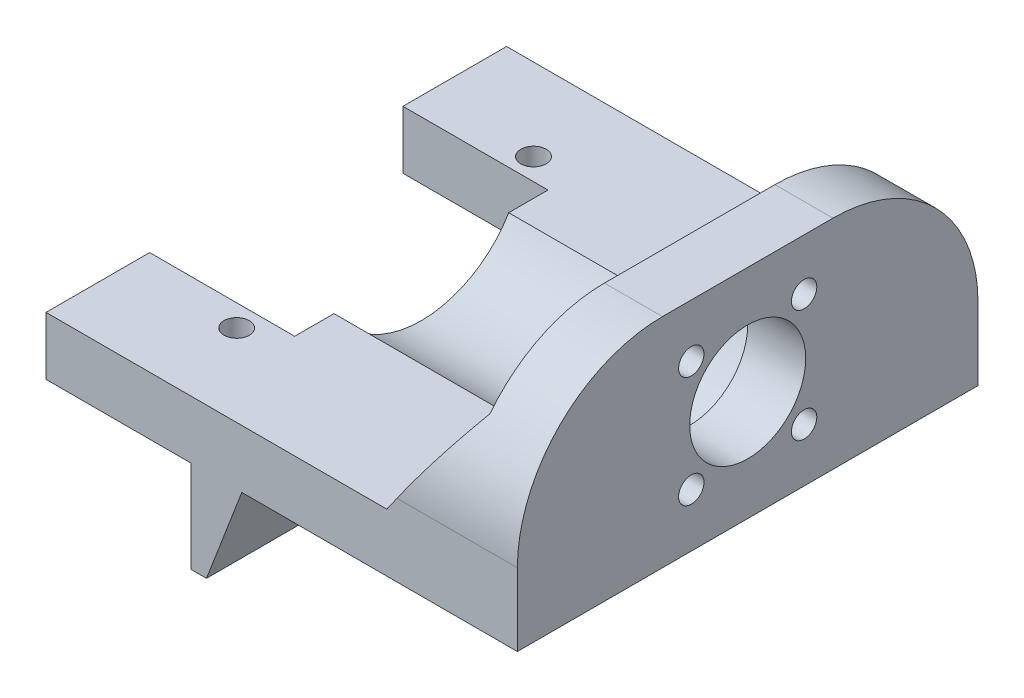
ISO-10303-21;
HEADER;
FILE_DESCRIPTION(('STEP AP214'),'2;1');
FILE_NAME('part.step','',(''),(''),'','','');
FILE_SCHEMA(('AUTOMOTIVE_DESIGN { 1 0 10303 214 1 1 1 1 }'));
ENDSEC;
DATA;
#1=APPLICATION_CONTEXT('core data for automotive mechanical design processes');
#2=APPLICATION_PROTOCOL_DEFINITION('international standard','automotive_design',2000,#1);
#3=PRODUCT_CONTEXT('',#1,'mechanical');
#4=PRODUCT('Part','Part','',(#3));
#5=PRODUCT_RELATED_PRODUCT_CATEGORY('part','',(#4));
#6=PRODUCT_DEFINITION_FORMATION('','',#4);
#7=PRODUCT_DEFINITION_CONTEXT('part definition',#1,'design');
#8=PRODUCT_DEFINITION('design','',#6,#7);
#9=PRODUCT_DEFINITION_SHAPE('','',#8);
#10=(LENGTH_UNIT() NAMED_UNIT(*) SI_UNIT(.MILLI.,.METRE.));
#11=(NAMED_UNIT(*) PLANE_ANGLE_UNIT() SI_UNIT($,.RADIAN.));
#12=(NAMED_UNIT(*) SI_UNIT($,.STERADIAN.) SOLID_ANGLE_UNIT());
#13=UNCERTAINTY_MEASURE_WITH_UNIT(LENGTH_MEASURE(1.E-05),#10,'distance_accuracy_value','');
#14=(GEOMETRIC_REPRESENTATION_CONTEXT(3) GLOBAL_UNCERTAINTY_ASSIGNED_CONTEXT((#13)) GLOBAL_UNIT_ASSIGNED_CONTEXT((#10,
#11,#12)) REPRESENTATION_CONTEXT('',''));
#15=CARTESIAN_POINT('',(0.,0.,0.));
#16=DIRECTION('',(0.,0.,1.));
#17=DIRECTION('',(1.,0.,0.));
#18=AXIS2_PLACEMENT_3D('',#15,#16,#17);
#19=CARTESIAN_POINT('',(0.,0.,0.));
#20=DIRECTION('',(0.,1.,0.));
#21=DIRECTION('',(0.,0.,1.));
#22=AXIS2_PLACEMENT_3D('',#19,#20,#21);
#23=PLANE('',#22);
#24=DIRECTION('',(1.,0.,0.));
#25=VECTOR('',#24,1.);
#26=CARTESIAN_POINT('',(0.,0.,31.755));
#27=LINE('',#26,#25);
#28=CARTESIAN_POINT('',(7.00000000000009,0.,31.755));
#29=VERTEX_POINT('',#28);
#30=CARTESIAN_POINT('',(45.,0.,31.755));
#31=VERTEX_POINT('',#30);
#32=EDGE_CURVE('E349',#29,#31,#27,.T.);
#33=ORIENTED_EDGE('',*,*,#32,.F.);
#34=DIRECTION('',(0.,0.,-1.));
#35=VECTOR('',#34,1.);
#36=CARTESIAN_POINT('',(7.00000000000009,0.,17.465));
#37=LINE('',#36,#35);
#38=CARTESIAN_POINT('',(7.00000000000009,0.,17.465));
#39=VERTEX_POINT('',#38);
#40=EDGE_CURVE('E404',#29,#39,#37,.T.);
#41=ORIENTED_EDGE('',*,*,#40,.T.);
#42=DIRECTION('',(1.,0.,0.));
#43=VECTOR('',#42,1.);
#44=CARTESIAN_POINT('',(0.,0.,17.465));
#45=LINE('',#44,#43);
#46=CARTESIAN_POINT('',(0.,0.,17.465));
#47=VERTEX_POINT('',#46);
#48=EDGE_CURVE('E270',#47,#39,#45,.T.);
#49=ORIENTED_EDGE('',*,*,#48,.F.);
#50=DIRECTION('',(0.,0.,-1.));
#51=VECTOR('',#50,1.);
#52=CARTESIAN_POINT('',(0.,0.,0.));
#53=LINE('',#52,#51);
#54=CARTESIAN_POINT('',(0.,0.,7.145));
#55=VERTEX_POINT('',#54);
#56=EDGE_CURVE('E341',#47,#55,#53,.T.);
#57=ORIENTED_EDGE('',*,*,#56,.T.);
#58=DIRECTION('',(-1.,0.,0.));
#59=VECTOR('',#58,1.);
#60=CARTESIAN_POINT('',(0.,0.,7.145));
#61=LINE('',#60,#59);
#62=CARTESIAN_POINT('',(7.00000000000009,0.,7.14500000000001));
#63=VERTEX_POINT('',#62);
#64=EDGE_CURVE('E239',#63,#55,#61,.T.);
#65=ORIENTED_EDGE('',*,*,#64,.F.);
#66=DIRECTION('',(0.,0.,-1.));
#67=VECTOR('',#66,1.);
#68=CARTESIAN_POINT('',(7.00000000000009,0.,-7.145));
#69=LINE('',#68,#67);
#70=CARTESIAN_POINT('',(7.00000000000009,0.,-7.14500000000001));
#71=VERTEX_POINT('',#70);
#72=EDGE_CURVE('E429',#63,#71,#69,.T.);
#73=ORIENTED_EDGE('',*,*,#72,.T.);
#74=DIRECTION('',(1.,0.,0.));
#75=VECTOR('',#74,1.);
#76=CARTESIAN_POINT('',(0.,0.,-7.145));
#77=LINE('',#76,#75);
#78=CARTESIAN_POINT('',(0.,0.,-7.145));
#79=VERTEX_POINT('',#78);
#80=EDGE_CURVE('E639',#79,#71,#77,.T.);
#81=ORIENTED_EDGE('',*,*,#80,.F.);
#82=CARTESIAN_POINT('',(0.,0.,-17.465));
#83=VERTEX_POINT('',#82);
#84=EDGE_CURVE('E244',#79,#83,#53,.T.);
#85=ORIENTED_EDGE('',*,*,#84,.T.);
#86=DIRECTION('',(-1.,0.,0.));
#87=VECTOR('',#86,1.);
#88=CARTESIAN_POINT('',(0.,0.,-17.465));
#89=LINE('',#88,#87);
#90=CARTESIAN_POINT('',(7.00000000000009,0.,-17.465));
#91=VERTEX_POINT('',#90);
#92=EDGE_CURVE('E250',#91,#83,#89,.T.);
#93=ORIENTED_EDGE('',*,*,#92,.F.);
#94=DIRECTION('',(0.,0.,-1.));
#95=VECTOR('',#94,1.);
#96=CARTESIAN_POINT('',(7.00000000000009,0.,-31.755));
#97=LINE('',#96,#95);
#98=CARTESIAN_POINT('',(7.00000000000009,0.,-31.755));
#99=VERTEX_POINT('',#98);
#100=EDGE_CURVE('E427',#91,#99,#97,.T.);
#101=ORIENTED_EDGE('',*,*,#100,.T.);
#102=DIRECTION('',(1.,0.,0.));
#103=VECTOR('',#102,1.);
#104=CARTESIAN_POINT('',(0.,0.,-31.755));
#105=LINE('',#104,#103);
#106=CARTESIAN_POINT('',(45.,0.,-31.755));
#107=VERTEX_POINT('',#106);
#108=EDGE_CURVE('E565',#99,#107,#105,.T.);
#109=ORIENTED_EDGE('',*,*,#108,.T.);
#110=DIRECTION('',(0.,0.,1.));
#111=VECTOR('',#110,1.);
#112=CARTESIAN_POINT('',(45.,0.,0.));
#113=LINE('',#112,#111);
#114=EDGE_CURVE('E352',#107,#31,#113,.T.);
#115=ORIENTED_EDGE('',*,*,#114,.T.);
#116=EDGE_LOOP('',(#33,#41,#49,#57,#65,#73,#81,#85,#93,#101,#109,#115));
#117=FACE_BOUND('',#116,.T.);
#118=ADVANCED_FACE('F34',(#117),#23,.F.);
#119=CARTESIAN_POINT('',(-5.,0.,-20.465));
#120=DIRECTION('',(0.,-1.,0.));
#121=DIRECTION('',(0.,0.,-1.));
#122=AXIS2_PLACEMENT_3D('',#119,#120,#121);
#123=CIRCLE('',#122,1.75);
#124=CARTESIAN_POINT('',(-5.,0.,-22.215));
#125=VERTEX_POINT('',#124);
#126=EDGE_CURVE('E279',#125,#125,#123,.T.);
#127=ORIENTED_EDGE('',*,*,#126,.F.);
#128=EDGE_LOOP('',(#127));
#129=FACE_BOUND('',#128,.T.);
#130=DIRECTION('',(0.,0.,-1.));
#131=VECTOR('',#130,1.);
#132=CARTESIAN_POINT('',(0.,0.,-17.465));
#133=LINE('',#132,#131);
#134=CARTESIAN_POINT('',(0.,0.,-31.755));
#135=VERTEX_POINT('',#134);
#136=EDGE_CURVE('E246',#83,#135,#133,.T.);
#137=ORIENTED_EDGE('',*,*,#136,.F.);
#138=DIRECTION('',(-1.,0.,0.));
#139=VECTOR('',#138,1.);
#140=CARTESIAN_POINT('',(0.,0.,-17.465));
#141=LINE('',#140,#139);
#142=CARTESIAN_POINT('',(-20.,0.,-17.465));
#143=VERTEX_POINT('',#142);
#144=EDGE_CURVE('E340',#83,#143,#141,.T.);
#145=ORIENTED_EDGE('',*,*,#144,.T.);
#146=DIRECTION('',(0.,0.,-1.));
#147=VECTOR('',#146,1.);
#148=CARTESIAN_POINT('',(-20.,0.,0.));
#149=LINE('',#148,#147);
#150=CARTESIAN_POINT('',(-20.,0.,-31.755));
#151=VERTEX_POINT('',#150);
#152=EDGE_CURVE('E558',#143,#151,#149,.T.);
#153=ORIENTED_EDGE('',*,*,#152,.T.);
#154=EDGE_CURVE('E560',#151,#135,#105,.T.);
#155=ORIENTED_EDGE('',*,*,#154,.T.);
#156=EDGE_LOOP('',(#137,#145,#153,#155));
#157=FACE_BOUND('',#156,.T.);
#158=ADVANCED_FACE('F566',(#129,#157),#23,.F.);
#159=CARTESIAN_POINT('',(-5.,0.,20.465));
#160=DIRECTION('',(0.,1.,0.));
#161=DIRECTION('',(0.,0.,1.));
#162=AXIS2_PLACEMENT_3D('',#159,#160,#161);
#163=CIRCLE('',#162,1.75);
#164=CARTESIAN_POINT('',(-5.,0.,22.215));
#165=VERTEX_POINT('',#164);
#166=EDGE_CURVE('E285',#165,#165,#163,.T.);
#167=ORIENTED_EDGE('',*,*,#166,.T.);
#168=EDGE_LOOP('',(#167));
#169=FACE_BOUND('',#168,.T.);
#170=DIRECTION('',(0.,0.,-1.));
#171=VECTOR('',#170,1.);
#172=CARTESIAN_POINT('',(0.,0.,17.465));
#173=LINE('',#172,#171);
#174=CARTESIAN_POINT('',(0.,0.,31.755));
#175=VERTEX_POINT('',#174);
#176=EDGE_CURVE('E267',#175,#47,#173,.T.);
#177=ORIENTED_EDGE('',*,*,#176,.F.);
#178=CARTESIAN_POINT('',(-20.,0.,31.755));
#179=VERTEX_POINT('',#178);
#180=EDGE_CURVE('E359',#179,#175,#27,.T.);
#181=ORIENTED_EDGE('',*,*,#180,.F.);
#182=DIRECTION('',(0.,0.,1.));
#183=VECTOR('',#182,1.);
#184=CARTESIAN_POINT('',(-20.,0.,0.));
#185=LINE('',#184,#183);
#186=CARTESIAN_POINT('',(-20.,0.,17.465));
#187=VERTEX_POINT('',#186);
#188=EDGE_CURVE('E346',#187,#179,#185,.T.);
#189=ORIENTED_EDGE('',*,*,#188,.F.);
#190=DIRECTION('',(-1.,0.,0.));
#191=VECTOR('',#190,1.);
#192=CARTESIAN_POINT('',(0.,0.,17.465));
#193=LINE('',#192,#191);
#194=EDGE_CURVE('E343',#47,#187,#193,.T.);
#195=ORIENTED_EDGE('',*,*,#194,.F.);
#196=EDGE_LOOP('',(#177,#181,#189,#195));
#197=FACE_BOUND('',#196,.T.);
#198=ADVANCED_FACE('F383',(#169,#197),#23,.F.);
#199=CARTESIAN_POINT('',(-20.,8.,-31.755));
#200=DIRECTION('',(0.,-1.,0.));
#201=DIRECTION('',(0.,0.,-1.));
#202=AXIS2_PLACEMENT_3D('',#199,#200,#201);
#203=PLANE('',#202);
#204=CARTESIAN_POINT('',(-5.,8.,-20.465));
#205=DIRECTION('',(0.,-1.,0.));
#206=DIRECTION('',(0.,0.,-1.));
#207=AXIS2_PLACEMENT_3D('',#204,#205,#206);
#208=CIRCLE('',#207,1.75);
#209=CARTESIAN_POINT('',(-5.,8.,-22.215));
#210=VERTEX_POINT('',#209);
#211=EDGE_CURVE('E278',#210,#210,#208,.T.);
#212=ORIENTED_EDGE('',*,*,#211,.T.);
#213=EDGE_LOOP('',(#212));
#214=FACE_BOUND('',#213,.T.);
#215=DIRECTION('',(-1.,0.,0.));
#216=VECTOR('',#215,1.);
#217=CARTESIAN_POINT('',(76.5979797464467,8.,-12.0454047254544));
#218=LINE('',#217,#216);
#219=CARTESIAN_POINT('',(0.,8.,-12.0454047254544));
#220=VERTEX_POINT('',#219);
#221=CARTESIAN_POINT('',(27.,8.,-12.0454047254544));
#222=VERTEX_POINT('',#221);
#223=EDGE_CURVE('E297',#220,#222,#218,.F.);
#224=ORIENTED_EDGE('',*,*,#223,.T.);
#225=DIRECTION('',(0.,0.,-1.));
#226=VECTOR('',#225,1.);
#227=CARTESIAN_POINT('',(27.,8.,-31.755));
#228=LINE('',#227,#226);
#229=CARTESIAN_POINT('',(27.,8.,-31.755));
#230=VERTEX_POINT('',#229);
#231=EDGE_CURVE('E473',#222,#230,#228,.T.);
#232=ORIENTED_EDGE('',*,*,#231,.T.);
#233=DIRECTION('',(1.,0.,0.));
#234=VECTOR('',#233,1.);
#235=CARTESIAN_POINT('',(-20.,8.,-31.755));
#236=LINE('',#235,#234);
#237=CARTESIAN_POINT('',(-20.,8.,-31.755));
#238=VERTEX_POINT('',#237);
#239=EDGE_CURVE('E318',#238,#230,#236,.T.);
#240=ORIENTED_EDGE('',*,*,#239,.F.);
#241=DIRECTION('',(0.,0.,1.));
#242=VECTOR('',#241,1.);
#243=CARTESIAN_POINT('',(-20.,8.,-31.755));
#244=LINE('',#243,#242);
#245=CARTESIAN_POINT('',(-20.,8.,-17.465));
#246=VERTEX_POINT('',#245);
#247=EDGE_CURVE('E328',#238,#246,#244,.T.);
#248=ORIENTED_EDGE('',*,*,#247,.T.);
#249=DIRECTION('',(1.,0.,0.));
#250=VECTOR('',#249,1.);
#251=CARTESIAN_POINT('',(0.,8.,-17.465));
#252=LINE('',#251,#250);
#253=CARTESIAN_POINT('',(0.,8.,-17.465));
#254=VERTEX_POINT('',#253);
#255=EDGE_CURVE('E453',#246,#254,#252,.T.);
#256=ORIENTED_EDGE('',*,*,#255,.T.);
#257=DIRECTION('',(0.,0.,1.));
#258=VECTOR('',#257,1.);
#259=CARTESIAN_POINT('',(0.,8.,0.));
#260=LINE('',#259,#258);
#261=EDGE_CURVE('E330',#254,#220,#260,.T.);
#262=ORIENTED_EDGE('',*,*,#261,.T.);
#263=EDGE_LOOP('',(#224,#232,#240,#248,#256,#262));
#264=FACE_BOUND('',#263,.T.);
#265=ADVANCED_FACE('F537',(#214,#264),#203,.F.);
#266=CARTESIAN_POINT('',(0.,30.,0.));
#267=DIRECTION('',(-1.,0.,0.));
#268=DIRECTION('',(0.,0.,1.));
#269=AXIS2_PLACEMENT_3D('',#266,#267,#268);
#270=PLANE('',#269);
#271=CARTESIAN_POINT('',(0.,15.135,0.));
#272=DIRECTION('',(-1.,0.,0.));
#273=DIRECTION('',(0.,0.,1.));
#274=AXIS2_PLACEMENT_3D('',#271,#272,#273);
#275=CIRCLE('',#274,14.);
#276=CARTESIAN_POINT('',(0.,8.,12.0454047254544));
#277=VERTEX_POINT('',#276);
#278=EDGE_CURVE('E288',#220,#277,#275,.T.);
#279=ORIENTED_EDGE('',*,*,#278,.F.);
#280=ORIENTED_EDGE('',*,*,#261,.F.);
#281=DIRECTION('',(0.,-1.,0.));
#282=VECTOR('',#281,1.);
#283=CARTESIAN_POINT('',(0.,30.,-17.465));
#284=LINE('',#283,#282);
#285=EDGE_CURVE('E339',#254,#83,#284,.T.);
#286=ORIENTED_EDGE('',*,*,#285,.T.);
#287=ORIENTED_EDGE('',*,*,#84,.F.);
#288=DIRECTION('',(0.,1.,0.));
#289=VECTOR('',#288,1.);
#290=CARTESIAN_POINT('',(0.,-12.7,-7.145));
#291=LINE('',#290,#289);
#292=CARTESIAN_POINT('',(0.,-12.7,-7.145));
#293=VERTEX_POINT('',#292);
#294=EDGE_CURVE('E225',#293,#79,#291,.T.);
#295=ORIENTED_EDGE('',*,*,#294,.F.);
#296=DIRECTION('',(0.,0.,-1.));
#297=VECTOR('',#296,1.);
#298=CARTESIAN_POINT('',(0.,-12.7,7.145));
#299=LINE('',#298,#297);
#300=CARTESIAN_POINT('',(0.,-12.7,7.145));
#301=VERTEX_POINT('',#300);
#302=EDGE_CURVE('E232',#301,#293,#299,.T.);
#303=ORIENTED_EDGE('',*,*,#302,.F.);
#304=DIRECTION('',(0.,1.,0.));
#305=VECTOR('',#304,1.);
#306=CARTESIAN_POINT('',(0.,-12.7,7.145));
#307=LINE('',#306,#305);
#308=EDGE_CURVE('E247',#301,#55,#307,.T.);
#309=ORIENTED_EDGE('',*,*,#308,.T.);
#310=ORIENTED_EDGE('',*,*,#56,.F.);
#311=DIRECTION('',(0.,-1.,0.));
#312=VECTOR('',#311,1.);
#313=CARTESIAN_POINT('',(0.,30.,17.465));
#314=LINE('',#313,#312);
#315=CARTESIAN_POINT('',(0.,8.,17.465));
#316=VERTEX_POINT('',#315);
#317=EDGE_CURVE('E391',#316,#47,#314,.T.);
#318=ORIENTED_EDGE('',*,*,#317,.F.);
#319=EDGE_CURVE('E327',#277,#316,#260,.T.);
#320=ORIENTED_EDGE('',*,*,#319,.F.);
#321=EDGE_LOOP('',(#279,#280,#286,#287,#295,#303,#309,#310,#318,#320));
#322=FACE_BOUND('',#321,.T.);
#323=ADVANCED_FACE('F242',(#322),#270,.T.);
#324=CARTESIAN_POINT('',(0.,30.,17.465));
#325=DIRECTION('',(0.,0.,1.));
#326=DIRECTION('',(1.,0.,0.));
#327=AXIS2_PLACEMENT_3D('',#324,#325,#326);
#328=PLANE('',#327);
#329=DIRECTION('',(0.,-1.,0.));
#330=VECTOR('',#329,1.);
#331=CARTESIAN_POINT('',(-20.,30.,17.465));
#332=LINE('',#331,#330);
#333=CARTESIAN_POINT('',(-20.,8.,17.465));
#334=VERTEX_POINT('',#333);
#335=EDGE_CURVE('E444',#334,#187,#332,.T.);
#336=ORIENTED_EDGE('',*,*,#335,.F.);
#337=DIRECTION('',(1.,0.,0.));
#338=VECTOR('',#337,1.);
#339=CARTESIAN_POINT('',(0.,8.,17.465));
#340=LINE('',#339,#338);
#341=EDGE_CURVE('E333',#334,#316,#340,.T.);
#342=ORIENTED_EDGE('',*,*,#341,.T.);
#343=ORIENTED_EDGE('',*,*,#317,.T.);
#344=ORIENTED_EDGE('',*,*,#194,.T.);
#345=EDGE_LOOP('',(#336,#342,#343,#344));
#346=FACE_BOUND('',#345,.T.);
#347=ADVANCED_FACE('F611',(#346),#328,.F.);
#348=CARTESIAN_POINT('',(-20.,30.,0.));
#349=DIRECTION('',(1.,0.,0.));
#350=DIRECTION('',(0.,0.,-1.));
#351=AXIS2_PLACEMENT_3D('',#348,#349,#350);
#352=PLANE('',#351);
#353=DIRECTION('',(0.,-1.,0.));
#354=VECTOR('',#353,1.);
#355=CARTESIAN_POINT('',(-20.,30.,31.755));
#356=LINE('',#355,#354);
#357=CARTESIAN_POINT('',(-20.,8.,31.755));
#358=VERTEX_POINT('',#357);
#359=EDGE_CURVE('E380',#358,#179,#356,.T.);
#360=ORIENTED_EDGE('',*,*,#359,.F.);
#361=EDGE_CURVE('E321',#334,#358,#244,.T.);
#362=ORIENTED_EDGE('',*,*,#361,.F.);
#363=ORIENTED_EDGE('',*,*,#335,.T.);
#364=ORIENTED_EDGE('',*,*,#188,.T.);
#365=EDGE_LOOP('',(#360,#362,#363,#364));
#366=FACE_BOUND('',#365,.T.);
#367=ADVANCED_FACE('F610',(#366),#352,.F.);
#368=CARTESIAN_POINT('',(0.,30.,31.755));
#369=DIRECTION('',(0.,0.,-1.));
#370=DIRECTION('',(-1.,0.,0.));
#371=AXIS2_PLACEMENT_3D('',#368,#369,#370);
#372=PLANE('',#371);
#373=DIRECTION('',(0.,-1.,0.));
#374=VECTOR('',#373,1.);
#375=CARTESIAN_POINT('',(45.,30.,31.755));
#376=LINE('',#375,#374);
#377=CARTESIAN_POINT('',(45.,10.,31.755));
#378=VERTEX_POINT('',#377);
#379=EDGE_CURVE('E436',#378,#31,#376,.T.);
#380=ORIENTED_EDGE('',*,*,#379,.F.);
#381=DIRECTION('',(1.,0.,0.));
#382=VECTOR('',#381,1.);
#383=CARTESIAN_POINT('',(37.,10.,31.755));
#384=LINE('',#383,#382);
#385=CARTESIAN_POINT('',(28.4004150764195,10.,31.755));
#386=VERTEX_POINT('',#385);
#387=EDGE_CURVE('E432',#378,#386,#384,.F.);
#388=ORIENTED_EDGE('',*,*,#387,.T.);
#389=DIRECTION('',(0.573576436351041,0.819152044288995,0.));
#390=VECTOR('',#389,1.);
#391=CARTESIAN_POINT('',(28.4538907635417,10.0763711959728,31.755));
#392=LINE('',#391,#390);
#393=CARTESIAN_POINT('',(27.,8.,31.755));
#394=VERTEX_POINT('',#393);
#395=EDGE_CURVE('E482',#386,#394,#392,.F.);
#396=ORIENTED_EDGE('',*,*,#395,.T.);
#397=DIRECTION('',(1.,0.,0.));
#398=VECTOR('',#397,1.);
#399=CARTESIAN_POINT('',(-20.,8.,31.755));
#400=LINE('',#399,#398);
#401=EDGE_CURVE('E317',#358,#394,#400,.T.);
#402=ORIENTED_EDGE('',*,*,#401,.F.);
#403=ORIENTED_EDGE('',*,*,#359,.T.);
#404=ORIENTED_EDGE('',*,*,#180,.T.);
#405=DIRECTION('',(0.,1.,0.));
#406=VECTOR('',#405,1.);
#407=CARTESIAN_POINT('',(0.,-12.7,31.755));
#408=LINE('',#407,#406);
#409=CARTESIAN_POINT('',(0.,-12.7,31.755));
#410=VERTEX_POINT('',#409);
#411=EDGE_CURVE('E273',#410,#175,#408,.T.);
#412=ORIENTED_EDGE('',*,*,#411,.F.);
#413=DIRECTION('',(-1.,0.,0.));
#414=VECTOR('',#413,1.);
#415=CARTESIAN_POINT('',(0.,-12.7,31.755));
#416=LINE('',#415,#414);
#417=CARTESIAN_POINT('',(2.12492675505036,-12.7,31.755));
#418=VERTEX_POINT('',#417);
#419=EDGE_CURVE('E79',#418,#410,#416,.T.);
#420=ORIENTED_EDGE('',*,*,#419,.F.);
#421=DIRECTION('',(-0.358367949545297,-0.933580426497203,0.));
#422=VECTOR('',#421,1.);
#423=CARTESIAN_POINT('',(16.1379659845538,23.805215259905,31.755));
#424=LINE('',#423,#422);
#425=EDGE_CURVE('E403',#418,#29,#424,.F.);
#426=ORIENTED_EDGE('',*,*,#425,.T.);
#427=ORIENTED_EDGE('',*,*,#32,.T.);
#428=EDGE_LOOP('',(#380,#388,#396,#402,#403,#404,#412,#420,#426,#427));
#429=FACE_BOUND('',#428,.T.);
#430=ADVANCED_FACE('F376',(#429),#372,.F.);
#431=CARTESIAN_POINT('',(45.,30.,0.));
#432=DIRECTION('',(1.,0.,0.));
#433=DIRECTION('',(0.,0.,-1.));
#434=AXIS2_PLACEMENT_3D('',#431,#432,#433);
#435=PLANE('',#434);
#436=CARTESIAN_POINT('',(45.,7.35682540694797,7.77817459305202));
#437=DIRECTION('',(1.,0.,0.));
#438=DIRECTION('',(0.,0.,-1.));
#439=AXIS2_PLACEMENT_3D('',#436,#437,#438);
#440=CIRCLE('',#439,1.75);
#441=CARTESIAN_POINT('',(45.,7.35682540694797,6.02817459305202));
#442=VERTEX_POINT('',#441);
#443=EDGE_CURVE('E300',#442,#442,#440,.T.);
#444=ORIENTED_EDGE('',*,*,#443,.F.);
#445=EDGE_LOOP('',(#444));
#446=FACE_BOUND('',#445,.T.);
#447=CARTESIAN_POINT('',(45.,7.35682540694797,-7.77817459305203));
#448=DIRECTION('',(1.,0.,0.));
#449=DIRECTION('',(0.,0.,-1.));
#450=AXIS2_PLACEMENT_3D('',#447,#448,#449);
#451=CIRCLE('',#450,1.75);
#452=CARTESIAN_POINT('',(45.,7.35682540694797,-9.52817459305203));
#453=VERTEX_POINT('',#452);
#454=EDGE_CURVE('E303',#453,#453,#451,.T.);
#455=ORIENTED_EDGE('',*,*,#454,.F.);
#456=EDGE_LOOP('',(#455));
#457=FACE_BOUND('',#456,.T.);
#458=CARTESIAN_POINT('',(45.,22.913174593052,-7.77817459305203));
#459=DIRECTION('',(1.,0.,0.));
#460=DIRECTION('',(0.,0.,-1.));
#461=AXIS2_PLACEMENT_3D('',#458,#459,#460);
#462=CIRCLE('',#461,1.75);
#463=CARTESIAN_POINT('',(45.,22.913174593052,-9.52817459305203));
#464=VERTEX_POINT('',#463);
#465=EDGE_CURVE('E306',#464,#464,#462,.T.);
#466=ORIENTED_EDGE('',*,*,#465,.F.);
#467=EDGE_LOOP('',(#466));
#468=FACE_BOUND('',#467,.T.);
#469=CARTESIAN_POINT('',(45.,22.6832638083079,7.77817459305202));
#470=DIRECTION('',(1.,0.,0.));
#471=DIRECTION('',(0.,0.,-1.));
#472=AXIS2_PLACEMENT_3D('',#469,#470,#471);
#473=CIRCLE('',#472,1.75);
#474=CARTESIAN_POINT('',(45.,22.6832638083079,6.02817459305202));
#475=VERTEX_POINT('',#474);
#476=EDGE_CURVE('E310',#475,#475,#473,.T.);
#477=ORIENTED_EDGE('',*,*,#476,.F.);
#478=EDGE_LOOP('',(#477));
#479=FACE_BOUND('',#478,.T.);
#480=CARTESIAN_POINT('',(45.,15.135,0.));
#481=DIRECTION('',(1.,0.,0.));
#482=DIRECTION('',(0.,0.,-1.));
#483=AXIS2_PLACEMENT_3D('',#480,#481,#482);
#484=CIRCLE('',#483,8.);
#485=CARTESIAN_POINT('',(45.,15.135,-8.00000000000001));
#486=VERTEX_POINT('',#485);
#487=EDGE_CURVE('E314',#486,#486,#484,.T.);
#488=ORIENTED_EDGE('',*,*,#487,.F.);
#489=EDGE_LOOP('',(#488));
#490=FACE_BOUND('',#489,.T.);
#491=DIRECTION('',(0.,-1.,0.));
#492=VECTOR('',#491,1.);
#493=CARTESIAN_POINT('',(45.,30.,-31.755));
#494=LINE('',#493,#492);
#495=CARTESIAN_POINT('',(45.,10.,-31.755));
#496=VERTEX_POINT('',#495);
#497=EDGE_CURVE('E442',#496,#107,#494,.T.);
#498=ORIENTED_EDGE('',*,*,#497,.F.);
#499=CARTESIAN_POINT('',(45.,10.,-11.755));
#500=DIRECTION('',(1.,0.,0.));
#501=DIRECTION('',(0.,0.,-1.));
#502=AXIS2_PLACEMENT_3D('',#499,#500,#501);
#503=CIRCLE('',#502,20.);
#504=CARTESIAN_POINT('',(45.,30.,-11.755));
#505=VERTEX_POINT('',#504);
#506=EDGE_CURVE('E491',#496,#505,#503,.T.);
#507=ORIENTED_EDGE('',*,*,#506,.T.);
#508=DIRECTION('',(0.,0.,1.));
#509=VECTOR('',#508,1.);
#510=CARTESIAN_POINT('',(45.,30.,0.));
#511=LINE('',#510,#509);
#512=CARTESIAN_POINT('',(45.,30.,11.755));
#513=VERTEX_POINT('',#512);
#514=EDGE_CURVE('E336',#505,#513,#511,.T.);
#515=ORIENTED_EDGE('',*,*,#514,.T.);
#516=CARTESIAN_POINT('',(45.,10.,11.755));
#517=DIRECTION('',(1.,0.,0.));
#518=DIRECTION('',(0.,0.,-1.));
#519=AXIS2_PLACEMENT_3D('',#516,#517,#518);
#520=CIRCLE('',#519,20.);
#521=EDGE_CURVE('E441',#513,#378,#520,.T.);
#522=ORIENTED_EDGE('',*,*,#521,.T.);
#523=ORIENTED_EDGE('',*,*,#379,.T.);
#524=ORIENTED_EDGE('',*,*,#114,.F.);
#525=EDGE_LOOP('',(#498,#507,#515,#522,#523,#524));
#526=FACE_BOUND('',#525,.T.);
#527=ADVANCED_FACE('F440',(#446,#457,#468,#479,#490,#526),#435,.T.);
#528=CARTESIAN_POINT('',(0.,30.,-31.755));
#529=DIRECTION('',(0.,0.,-1.));
#530=DIRECTION('',(-1.,0.,0.));
#531=AXIS2_PLACEMENT_3D('',#528,#529,#530);
#532=PLANE('',#531);
#533=DIRECTION('',(-0.573576436351041,-0.819152044288995,0.));
#534=VECTOR('',#533,1.);
#535=CARTESIAN_POINT('',(37.,22.2814800674213,-31.755));
#536=LINE('',#535,#534);
#537=CARTESIAN_POINT('',(28.4004150764194,10.,-31.755));
#538=VERTEX_POINT('',#537);
#539=EDGE_CURVE('E479',#230,#538,#536,.F.);
#540=ORIENTED_EDGE('',*,*,#539,.T.);
#541=DIRECTION('',(1.,0.,0.));
#542=VECTOR('',#541,1.);
#543=CARTESIAN_POINT('',(0.,10.,-31.755));
#544=LINE('',#543,#542);
#545=EDGE_CURVE('E487',#538,#496,#544,.T.);
#546=ORIENTED_EDGE('',*,*,#545,.T.);
#547=ORIENTED_EDGE('',*,*,#497,.T.);
#548=ORIENTED_EDGE('',*,*,#108,.F.);
#549=DIRECTION('',(0.358367949545297,0.933580426497203,0.));
#550=VECTOR('',#549,1.);
#551=CARTESIAN_POINT('',(2.,-13.0254453234694,-31.755));
#552=LINE('',#551,#550);
#553=CARTESIAN_POINT('',(2.12492675505036,-12.7,-31.755));
#554=VERTEX_POINT('',#553);
#555=EDGE_CURVE('E11',#99,#554,#552,.F.);
#556=ORIENTED_EDGE('',*,*,#555,.T.);
#557=DIRECTION('',(1.,0.,0.));
#558=VECTOR('',#557,1.);
#559=CARTESIAN_POINT('',(0.,-12.7,-31.755));
#560=LINE('',#559,#558);
#561=CARTESIAN_POINT('',(0.,-12.7,-31.755));
#562=VERTEX_POINT('',#561);
#563=EDGE_CURVE('E49',#562,#554,#560,.T.);
#564=ORIENTED_EDGE('',*,*,#563,.F.);
#565=DIRECTION('',(0.,1.,0.));
#566=VECTOR('',#565,1.);
#567=CARTESIAN_POINT('',(0.,-12.7,-31.755));
#568=LINE('',#567,#566);
#569=EDGE_CURVE('E264',#562,#135,#568,.T.);
#570=ORIENTED_EDGE('',*,*,#569,.T.);
#571=ORIENTED_EDGE('',*,*,#154,.F.);
#572=DIRECTION('',(0.,-1.,0.));
#573=VECTOR('',#572,1.);
#574=CARTESIAN_POINT('',(-20.,30.,-31.755));
#575=LINE('',#574,#573);
#576=EDGE_CURVE('E447',#238,#151,#575,.T.);
#577=ORIENTED_EDGE('',*,*,#576,.F.);
#578=ORIENTED_EDGE('',*,*,#239,.T.);
#579=EDGE_LOOP('',(#540,#546,#547,#548,#556,#564,#570,#571,#577,#578));
#580=FACE_BOUND('',#579,.T.);
#581=ADVANCED_FACE('F561',(#580),#532,.T.);
#582=CARTESIAN_POINT('',(-20.,30.,0.));
#583=DIRECTION('',(-1.,0.,0.));
#584=DIRECTION('',(0.,0.,1.));
#585=AXIS2_PLACEMENT_3D('',#582,#583,#584);
#586=PLANE('',#585);
#587=ORIENTED_EDGE('',*,*,#247,.F.);
#588=ORIENTED_EDGE('',*,*,#576,.T.);
#589=ORIENTED_EDGE('',*,*,#152,.F.);
#590=DIRECTION('',(0.,-1.,0.));
#591=VECTOR('',#590,1.);
#592=CARTESIAN_POINT('',(-20.,30.,-17.465));
#593=LINE('',#592,#591);
#594=EDGE_CURVE('E546',#246,#143,#593,.T.);
#595=ORIENTED_EDGE('',*,*,#594,.F.);
#596=EDGE_LOOP('',(#587,#588,#589,#595));
#597=FACE_BOUND('',#596,.T.);
#598=ADVANCED_FACE('F556',(#597),#586,.T.);
#599=CARTESIAN_POINT('',(0.,30.,-17.465));
#600=DIRECTION('',(0.,0.,1.));
#601=DIRECTION('',(1.,0.,0.));
#602=AXIS2_PLACEMENT_3D('',#599,#600,#601);
#603=PLANE('',#602);
#604=ORIENTED_EDGE('',*,*,#255,.F.);
#605=ORIENTED_EDGE('',*,*,#594,.T.);
#606=ORIENTED_EDGE('',*,*,#144,.F.);
#607=ORIENTED_EDGE('',*,*,#285,.F.);
#608=EDGE_LOOP('',(#604,#605,#606,#607));
#609=FACE_BOUND('',#608,.T.);
#610=ADVANCED_FACE('F543',(#609),#603,.T.);
#611=CARTESIAN_POINT('',(0.,30.,0.));
#612=DIRECTION('',(0.,1.,0.));
#613=DIRECTION('',(0.,0.,1.));
#614=AXIS2_PLACEMENT_3D('',#611,#612,#613);
#615=PLANE('',#614);
#616=ORIENTED_EDGE('',*,*,#514,.F.);
#617=DIRECTION('',(1.,0.,0.));
#618=VECTOR('',#617,1.);
#619=CARTESIAN_POINT('',(0.,30.,-11.755));
#620=LINE('',#619,#618);
#621=CARTESIAN_POINT('',(37.,30.,-11.755));
#622=VERTEX_POINT('',#621);
#623=EDGE_CURVE('E496',#505,#622,#620,.F.);
#624=ORIENTED_EDGE('',*,*,#623,.T.);
#625=DIRECTION('',(0.,0.,1.));
#626=VECTOR('',#625,1.);
#627=CARTESIAN_POINT('',(37.,30.,-31.755));
#628=LINE('',#627,#626);
#629=CARTESIAN_POINT('',(37.,30.,11.755));
#630=VERTEX_POINT('',#629);
#631=EDGE_CURVE('E324',#622,#630,#628,.T.);
#632=ORIENTED_EDGE('',*,*,#631,.T.);
#633=DIRECTION('',(1.,0.,0.));
#634=VECTOR('',#633,1.);
#635=CARTESIAN_POINT('',(45.,30.,11.755));
#636=LINE('',#635,#634);
#637=EDGE_CURVE('E493',#630,#513,#636,.T.);
#638=ORIENTED_EDGE('',*,*,#637,.T.);
#639=EDGE_LOOP('',(#616,#624,#632,#638));
#640=FACE_BOUND('',#639,.T.);
#641=ADVANCED_FACE('F521',(#640),#615,.T.);
#642=CARTESIAN_POINT('',(-5.,8.,20.465));
#643=DIRECTION('',(0.,1.,0.));
#644=DIRECTION('',(0.,0.,1.));
#645=AXIS2_PLACEMENT_3D('',#642,#643,#644);
#646=CIRCLE('',#645,1.75);
#647=CARTESIAN_POINT('',(-5.,8.,22.215));
#648=VERTEX_POINT('',#647);
#649=EDGE_CURVE('E282',#648,#648,#646,.T.);
#650=ORIENTED_EDGE('',*,*,#649,.F.);
#651=EDGE_LOOP('',(#650));
#652=FACE_BOUND('',#651,.T.);
#653=ORIENTED_EDGE('',*,*,#401,.T.);
#654=DIRECTION('',(0.,0.,-1.));
#655=VECTOR('',#654,1.);
#656=CARTESIAN_POINT('',(27.,8.,12.0454047254544));
#657=LINE('',#656,#655);
#658=CARTESIAN_POINT('',(27.,8.,12.0454047254544));
#659=VERTEX_POINT('',#658);
#660=EDGE_CURVE('E475',#394,#659,#657,.T.);
#661=ORIENTED_EDGE('',*,*,#660,.T.);
#662=DIRECTION('',(-1.,0.,0.));
#663=VECTOR('',#662,1.);
#664=CARTESIAN_POINT('',(76.5979797464467,8.,12.0454047254544));
#665=LINE('',#664,#663);
#666=EDGE_CURVE('E295',#659,#277,#665,.T.);
#667=ORIENTED_EDGE('',*,*,#666,.T.);
#668=ORIENTED_EDGE('',*,*,#319,.T.);
#669=ORIENTED_EDGE('',*,*,#341,.F.);
#670=ORIENTED_EDGE('',*,*,#361,.T.);
#671=EDGE_LOOP('',(#653,#661,#667,#668,#669,#670));
#672=FACE_BOUND('',#671,.T.);
#673=ADVANCED_FACE('F595',(#652,#672),#203,.F.);
#674=CARTESIAN_POINT('',(37.,30.,-31.755));
#675=DIRECTION('',(1.,0.,0.));
#676=DIRECTION('',(0.,1.,0.));
#677=AXIS2_PLACEMENT_3D('',#674,#675,#676);
#678=PLANE('',#677);
#679=CARTESIAN_POINT('',(37.,7.35682540694797,7.77817459305202));
#680=DIRECTION('',(1.,0.,0.));
#681=DIRECTION('',(0.,1.,0.));
#682=AXIS2_PLACEMENT_3D('',#679,#680,#681);
#683=CIRCLE('',#682,1.75);
#684=CARTESIAN_POINT('',(37.,9.10682540694797,7.77817459305202));
#685=VERTEX_POINT('',#684);
#686=EDGE_CURVE('E465',#685,#685,#683,.T.);
#687=ORIENTED_EDGE('',*,*,#686,.T.);
#688=EDGE_LOOP('',(#687));
#689=FACE_BOUND('',#688,.T.);
#690=CARTESIAN_POINT('',(37.,7.35682540694797,-7.77817459305203));
#691=DIRECTION('',(1.,0.,0.));
#692=DIRECTION('',(0.,1.,0.));
#693=AXIS2_PLACEMENT_3D('',#690,#691,#692);
#694=CIRCLE('',#693,1.75);
#695=CARTESIAN_POINT('',(37.,9.10682540694797,-7.77817459305203));
#696=VERTEX_POINT('',#695);
#697=EDGE_CURVE('E458',#696,#696,#694,.T.);
#698=ORIENTED_EDGE('',*,*,#697,.T.);
#699=EDGE_LOOP('',(#698));
#700=FACE_BOUND('',#699,.T.);
#701=CARTESIAN_POINT('',(37.,15.135,0.));
#702=DIRECTION('',(1.,0.,0.));
#703=DIRECTION('',(0.,1.,0.));
#704=AXIS2_PLACEMENT_3D('',#701,#702,#703);
#705=CIRCLE('',#704,8.);
#706=CARTESIAN_POINT('',(37.,23.135,0.));
#707=VERTEX_POINT('',#706);
#708=EDGE_CURVE('E455',#707,#707,#705,.T.);
#709=ORIENTED_EDGE('',*,*,#708,.T.);
#710=EDGE_LOOP('',(#709));
#711=FACE_BOUND('',#710,.T.);
#712=ORIENTED_EDGE('',*,*,#631,.F.);
#713=CARTESIAN_POINT('',(37.,10.,-11.755));
#714=DIRECTION('',(1.,0.,0.));
#715=DIRECTION('',(0.,1.,0.));
#716=AXIS2_PLACEMENT_3D('',#713,#714,#715);
#717=CIRCLE('',#716,20.);
#718=CARTESIAN_POINT('',(37.,22.2814800674213,-27.5399690323907));
#719=VERTEX_POINT('',#718);
#720=EDGE_CURVE('E500',#622,#719,#717,.F.);
#721=ORIENTED_EDGE('',*,*,#720,.T.);
#722=DIRECTION('',(0.,0.,1.));
#723=VECTOR('',#722,1.);
#724=CARTESIAN_POINT('',(37.,22.2814800674213,-12.0454047254544));
#725=LINE('',#724,#723);
#726=CARTESIAN_POINT('',(37.,22.2814800674213,-12.0385972042406));
#727=VERTEX_POINT('',#726);
#728=EDGE_CURVE('E471',#719,#727,#725,.T.);
#729=ORIENTED_EDGE('',*,*,#728,.T.);
#730=CARTESIAN_POINT('',(37.,15.135,0.));
#731=DIRECTION('',(1.,0.,0.));
#732=DIRECTION('',(0.,1.,0.));
#733=AXIS2_PLACEMENT_3D('',#730,#731,#732);
#734=CIRCLE('',#733,14.);
#735=CARTESIAN_POINT('',(37.,22.2814800674213,12.0385972042406));
#736=VERTEX_POINT('',#735);
#737=EDGE_CURVE('E293',#727,#736,#734,.F.);
#738=ORIENTED_EDGE('',*,*,#737,.T.);
#739=DIRECTION('',(0.,0.,1.));
#740=VECTOR('',#739,1.);
#741=CARTESIAN_POINT('',(37.,22.2814800674213,31.755));
#742=LINE('',#741,#740);
#743=CARTESIAN_POINT('',(37.,22.2814800674213,27.5399690323907));
#744=VERTEX_POINT('',#743);
#745=EDGE_CURVE('E468',#736,#744,#742,.T.);
#746=ORIENTED_EDGE('',*,*,#745,.T.);
#747=CARTESIAN_POINT('',(37.,10.,11.755));
#748=DIRECTION('',(1.,0.,0.));
#749=DIRECTION('',(0.,1.,0.));
#750=AXIS2_PLACEMENT_3D('',#747,#748,#749);
#751=CIRCLE('',#750,20.);
#752=EDGE_CURVE('E498',#744,#630,#751,.F.);
#753=ORIENTED_EDGE('',*,*,#752,.T.);
#754=EDGE_LOOP('',(#712,#721,#729,#738,#746,#753));
#755=FACE_BOUND('',#754,.T.);
#756=CARTESIAN_POINT('',(37.,22.6832638083079,7.77817459305202));
#757=DIRECTION('',(1.,0.,0.));
#758=DIRECTION('',(0.,1.,0.));
#759=AXIS2_PLACEMENT_3D('',#756,#757,#758);
#760=CIRCLE('',#759,1.75);
#761=CARTESIAN_POINT('',(37.,24.4332638083079,7.77817459305202));
#762=VERTEX_POINT('',#761);
#763=EDGE_CURVE('E313',#762,#762,#760,.T.);
#764=ORIENTED_EDGE('',*,*,#763,.T.);
#765=EDGE_LOOP('',(#764));
#766=FACE_BOUND('',#765,.T.);
#767=CARTESIAN_POINT('',(37.,22.913174593052,-7.77817459305203));
#768=DIRECTION('',(1.,0.,0.));
#769=DIRECTION('',(0.,1.,0.));
#770=AXIS2_PLACEMENT_3D('',#767,#768,#769);
#771=CIRCLE('',#770,1.75);
#772=CARTESIAN_POINT('',(37.,24.663174593052,-7.77817459305203));
#773=VERTEX_POINT('',#772);
#774=EDGE_CURVE('E309',#773,#773,#771,.T.);
#775=ORIENTED_EDGE('',*,*,#774,.T.);
#776=EDGE_LOOP('',(#775));
#777=FACE_BOUND('',#776,.T.);
#778=ADVANCED_FACE('F516',(#689,#700,#711,#755,#766,#777),#678,.F.);
#779=CARTESIAN_POINT('',(-20.,15.135,0.));
#780=DIRECTION('',(1.,0.,0.));
#781=DIRECTION('',(0.,0.,-1.));
#782=AXIS2_PLACEMENT_3D('',#779,#780,#781);
#783=CYLINDRICAL_SURFACE('',#782,8.);
#784=ORIENTED_EDGE('',*,*,#708,.F.);
#785=EDGE_LOOP('',(#784));
#786=FACE_BOUND('',#785,.T.);
#787=ORIENTED_EDGE('',*,*,#487,.T.);
#788=EDGE_LOOP('',(#787));
#789=FACE_BOUND('',#788,.T.);
#790=ADVANCED_FACE('F824',(#786,#789),#783,.F.);
#791=CARTESIAN_POINT('',(-20.,22.6832638083079,7.77817459305202));
#792=DIRECTION('',(1.,0.,0.));
#793=DIRECTION('',(0.,0.,-1.));
#794=AXIS2_PLACEMENT_3D('',#791,#792,#793);
#795=CYLINDRICAL_SURFACE('',#794,1.75);
#796=ORIENTED_EDGE('',*,*,#476,.T.);
#797=EDGE_LOOP('',(#796));
#798=FACE_BOUND('',#797,.T.);
#799=ORIENTED_EDGE('',*,*,#763,.F.);
#800=EDGE_LOOP('',(#799));
#801=FACE_BOUND('',#800,.T.);
#802=ADVANCED_FACE('F856',(#798,#801),#795,.F.);
#803=CARTESIAN_POINT('',(-20.,22.913174593052,-7.77817459305203));
#804=DIRECTION('',(1.,0.,0.));
#805=DIRECTION('',(0.,0.,-1.));
#806=AXIS2_PLACEMENT_3D('',#803,#804,#805);
#807=CYLINDRICAL_SURFACE('',#806,1.75);
#808=ORIENTED_EDGE('',*,*,#465,.T.);
#809=EDGE_LOOP('',(#808));
#810=FACE_BOUND('',#809,.T.);
#811=ORIENTED_EDGE('',*,*,#774,.F.);
#812=EDGE_LOOP('',(#811));
#813=FACE_BOUND('',#812,.T.);
#814=ADVANCED_FACE('F846',(#810,#813),#807,.F.);
#815=CARTESIAN_POINT('',(-20.,7.35682540694797,-7.77817459305203));
#816=DIRECTION('',(1.,0.,0.));
#817=DIRECTION('',(0.,0.,-1.));
#818=AXIS2_PLACEMENT_3D('',#815,#816,#817);
#819=CYLINDRICAL_SURFACE('',#818,1.75);
#820=ORIENTED_EDGE('',*,*,#697,.F.);
#821=EDGE_LOOP('',(#820));
#822=FACE_BOUND('',#821,.T.);
#823=ORIENTED_EDGE('',*,*,#454,.T.);
#824=EDGE_LOOP('',(#823));
#825=FACE_BOUND('',#824,.T.);
#826=ADVANCED_FACE('F837',(#822,#825),#819,.F.);
#827=CARTESIAN_POINT('',(-20.,7.35682540694797,7.77817459305202));
#828=DIRECTION('',(1.,0.,0.));
#829=DIRECTION('',(0.,0.,-1.));
#830=AXIS2_PLACEMENT_3D('',#827,#828,#829);
#831=CYLINDRICAL_SURFACE('',#830,1.75);
#832=ORIENTED_EDGE('',*,*,#686,.F.);
#833=EDGE_LOOP('',(#832));
#834=FACE_BOUND('',#833,.T.);
#835=ORIENTED_EDGE('',*,*,#443,.T.);
#836=EDGE_LOOP('',(#835));
#837=FACE_BOUND('',#836,.T.);
#838=ADVANCED_FACE('F814',(#834,#837),#831,.F.);
#839=CARTESIAN_POINT('',(76.5979797464467,15.135,0.));
#840=DIRECTION('',(-1.,0.,0.));
#841=DIRECTION('',(0.,0.,1.));
#842=AXIS2_PLACEMENT_3D('',#839,#840,#841);
#843=CYLINDRICAL_SURFACE('',#842,14.);
#844=ORIENTED_EDGE('',*,*,#278,.T.);
#845=ORIENTED_EDGE('',*,*,#666,.F.);
#846=CARTESIAN_POINT('',(31.9959807851263,15.135,0.));
#847=DIRECTION('',(-0.819152044288995,0.573576436351041,0.));
#848=DIRECTION('',(-0.573576436351041,-0.819152044288995,0.));
#849=AXIS2_PLACEMENT_3D('',#846,#847,#848);
#850=ELLIPSE('',#849,17.0908442426603,14.);
#851=EDGE_CURVE('E484',#659,#736,#850,.T.);
#852=ORIENTED_EDGE('',*,*,#851,.T.);
#853=ORIENTED_EDGE('',*,*,#737,.F.);
#854=CARTESIAN_POINT('',(31.9959807851263,15.135,0.));
#855=DIRECTION('',(-0.819152044288995,0.573576436351041,0.));
#856=DIRECTION('',(-0.573576436351041,-0.819152044288995,0.));
#857=AXIS2_PLACEMENT_3D('',#854,#855,#856);
#858=ELLIPSE('',#857,17.0908442426603,14.);
#859=EDGE_CURVE('E477',#727,#222,#858,.T.);
#860=ORIENTED_EDGE('',*,*,#859,.T.);
#861=ORIENTED_EDGE('',*,*,#223,.F.);
#862=EDGE_LOOP('',(#844,#845,#852,#853,#860,#861));
#863=FACE_BOUND('',#862,.T.);
#864=ADVANCED_FACE('F535',(#863),#843,.F.);
#865=CARTESIAN_POINT('',(-5.,0.,20.465));
#866=DIRECTION('',(0.,1.,0.));
#867=DIRECTION('',(0.,0.,1.));
#868=AXIS2_PLACEMENT_3D('',#865,#866,#867);
#869=CYLINDRICAL_SURFACE('',#868,1.75);
#870=ORIENTED_EDGE('',*,*,#166,.F.);
#871=EDGE_LOOP('',(#870));
#872=FACE_BOUND('',#871,.T.);
#873=ORIENTED_EDGE('',*,*,#649,.T.);
#874=EDGE_LOOP('',(#873));
#875=FACE_BOUND('',#874,.T.);
#876=ADVANCED_FACE('F598',(#872,#875),#869,.F.);
#877=CARTESIAN_POINT('',(-5.,0.,-20.465));
#878=DIRECTION('',(0.,1.,0.));
#879=DIRECTION('',(0.,0.,1.));
#880=AXIS2_PLACEMENT_3D('',#877,#878,#879);
#881=CYLINDRICAL_SURFACE('',#880,1.75);
#882=ORIENTED_EDGE('',*,*,#126,.T.);
#883=EDGE_LOOP('',(#882));
#884=FACE_BOUND('',#883,.T.);
#885=ORIENTED_EDGE('',*,*,#211,.F.);
#886=EDGE_LOOP('',(#885));
#887=FACE_BOUND('',#886,.T.);
#888=ADVANCED_FACE('F601',(#884,#887),#881,.F.);
#889=CARTESIAN_POINT('',(37.,22.2814800674213,-31.755));
#890=DIRECTION('',(-0.819152044288995,0.573576436351041,0.));
#891=DIRECTION('',(0.,0.,-1.));
#892=AXIS2_PLACEMENT_3D('',#889,#890,#891);
#893=PLANE('',#892);
#894=ORIENTED_EDGE('',*,*,#728,.F.);
#895=CARTESIAN_POINT('',(28.4004150764194,10.,-11.755));
#896=DIRECTION('',(-0.819152044288995,0.573576436351041,0.));
#897=DIRECTION('',(0.573576436351041,0.819152044288995,0.));
#898=AXIS2_PLACEMENT_3D('',#895,#896,#897);
#899=ELLIPSE('',#898,24.415491775229,20.);
#900=EDGE_CURVE('E502',#719,#538,#899,.T.);
#901=ORIENTED_EDGE('',*,*,#900,.T.);
#902=ORIENTED_EDGE('',*,*,#539,.F.);
#903=ORIENTED_EDGE('',*,*,#231,.F.);
#904=ORIENTED_EDGE('',*,*,#859,.F.);
#905=EDGE_LOOP('',(#894,#901,#902,#903,#904));
#906=FACE_BOUND('',#905,.T.);
#907=ADVANCED_FACE('F531',(#906),#893,.T.);
#908=CARTESIAN_POINT('',(37.,22.2814800674213,-31.755));
#909=DIRECTION('',(-0.819152044288995,0.573576436351041,0.));
#910=DIRECTION('',(0.,0.,-1.));
#911=AXIS2_PLACEMENT_3D('',#908,#909,#910);
#912=PLANE('',#911);
#913=ORIENTED_EDGE('',*,*,#395,.F.);
#914=CARTESIAN_POINT('',(28.4004150764194,10.,11.755));
#915=DIRECTION('',(-0.819152044288995,0.573576436351041,0.));
#916=DIRECTION('',(-0.573576436351041,-0.819152044288995,0.));
#917=AXIS2_PLACEMENT_3D('',#914,#915,#916);
#918=ELLIPSE('',#917,24.415491775229,20.);
#919=EDGE_CURVE('E363',#386,#744,#918,.T.);
#920=ORIENTED_EDGE('',*,*,#919,.T.);
#921=ORIENTED_EDGE('',*,*,#745,.F.);
#922=ORIENTED_EDGE('',*,*,#851,.F.);
#923=ORIENTED_EDGE('',*,*,#660,.F.);
#924=EDGE_LOOP('',(#913,#920,#921,#922,#923));
#925=FACE_BOUND('',#924,.T.);
#926=ADVANCED_FACE('F508',(#925),#912,.T.);
#927=CARTESIAN_POINT('',(0.,10.,-11.755));
#928=DIRECTION('',(1.,0.,0.));
#929=DIRECTION('',(0.,0.,-1.));
#930=AXIS2_PLACEMENT_3D('',#927,#928,#929);
#931=CYLINDRICAL_SURFACE('',#930,20.);
#932=ORIENTED_EDGE('',*,*,#720,.F.);
#933=ORIENTED_EDGE('',*,*,#623,.F.);
#934=ORIENTED_EDGE('',*,*,#506,.F.);
#935=ORIENTED_EDGE('',*,*,#545,.F.);
#936=ORIENTED_EDGE('',*,*,#900,.F.);
#937=EDGE_LOOP('',(#932,#933,#934,#935,#936));
#938=FACE_BOUND('',#937,.T.);
#939=ADVANCED_FACE('F524',(#938),#931,.T.);
#940=CARTESIAN_POINT('',(0.,10.,11.755));
#941=DIRECTION('',(-1.,0.,0.));
#942=DIRECTION('',(0.,0.,1.));
#943=AXIS2_PLACEMENT_3D('',#940,#941,#942);
#944=CYLINDRICAL_SURFACE('',#943,20.);
#945=ORIENTED_EDGE('',*,*,#919,.F.);
#946=ORIENTED_EDGE('',*,*,#387,.F.);
#947=ORIENTED_EDGE('',*,*,#521,.F.);
#948=ORIENTED_EDGE('',*,*,#637,.F.);
#949=ORIENTED_EDGE('',*,*,#752,.F.);
#950=EDGE_LOOP('',(#945,#946,#947,#948,#949));
#951=FACE_BOUND('',#950,.T.);
#952=ADVANCED_FACE('F512',(#951),#944,.T.);
#953=CARTESIAN_POINT('',(0.,-12.7,17.465));
#954=DIRECTION('',(1.,0.,0.));
#955=DIRECTION('',(0.,0.,-1.));
#956=AXIS2_PLACEMENT_3D('',#953,#954,#955);
#957=PLANE('',#956);
#958=ORIENTED_EDGE('',*,*,#176,.T.);
#959=DIRECTION('',(0.,1.,0.));
#960=VECTOR('',#959,1.);
#961=CARTESIAN_POINT('',(0.,-12.7,17.465));
#962=LINE('',#961,#960);
#963=CARTESIAN_POINT('',(0.,-12.7,17.465));
#964=VERTEX_POINT('',#963);
#965=EDGE_CURVE('E275',#964,#47,#962,.T.);
#966=ORIENTED_EDGE('',*,*,#965,.F.);
#967=DIRECTION('',(0.,0.,-1.));
#968=VECTOR('',#967,1.);
#969=CARTESIAN_POINT('',(0.,-12.7,17.465));
#970=LINE('',#969,#968);
#971=EDGE_CURVE('E268',#410,#964,#970,.T.);
#972=ORIENTED_EDGE('',*,*,#971,.F.);
#973=ORIENTED_EDGE('',*,*,#411,.T.);
#974=EDGE_LOOP('',(#958,#966,#972,#973));
#975=FACE_BOUND('',#974,.T.);
#976=ADVANCED_FACE('F373',(#975),#957,.F.);
#977=CARTESIAN_POINT('',(0.,-12.7,17.465));
#978=DIRECTION('',(0.,0.,1.));
#979=DIRECTION('',(1.,0.,0.));
#980=AXIS2_PLACEMENT_3D('',#977,#978,#979);
#981=PLANE('',#980);
#982=ORIENTED_EDGE('',*,*,#48,.T.);
#983=DIRECTION('',(0.358367949545297,0.933580426497203,0.));
#984=VECTOR('',#983,1.);
#985=CARTESIAN_POINT('',(1.85202753879226,-13.4109267640375,17.465));
#986=LINE('',#985,#984);
#987=CARTESIAN_POINT('',(2.12492675505036,-12.7,17.465));
#988=VERTEX_POINT('',#987);
#989=EDGE_CURVE('E397',#39,#988,#986,.F.);
#990=ORIENTED_EDGE('',*,*,#989,.T.);
#991=DIRECTION('',(1.,0.,0.));
#992=VECTOR('',#991,1.);
#993=CARTESIAN_POINT('',(0.,-12.7,17.465));
#994=LINE('',#993,#992);
#995=EDGE_CURVE('E70',#964,#988,#994,.T.);
#996=ORIENTED_EDGE('',*,*,#995,.F.);
#997=ORIENTED_EDGE('',*,*,#965,.T.);
#998=EDGE_LOOP('',(#982,#990,#996,#997));
#999=FACE_BOUND('',#998,.T.);
#1000=ADVANCED_FACE('F395',(#999),#981,.F.);
#1001=CARTESIAN_POINT('',(0.,-12.7,0.));
#1002=DIRECTION('',(0.,1.,0.));
#1003=DIRECTION('',(0.,0.,1.));
#1004=AXIS2_PLACEMENT_3D('',#1001,#1002,#1003);
#1005=PLANE('',#1004);
#1006=ORIENTED_EDGE('',*,*,#971,.T.);
#1007=ORIENTED_EDGE('',*,*,#995,.T.);
#1008=DIRECTION('',(0.,0.,-1.));
#1009=VECTOR('',#1008,1.);
#1010=CARTESIAN_POINT('',(2.12492675505036,-12.7,0.));
#1011=LINE('',#1010,#1009);
#1012=EDGE_CURVE('E400',#988,#418,#1011,.F.);
#1013=ORIENTED_EDGE('',*,*,#1012,.T.);
#1014=ORIENTED_EDGE('',*,*,#419,.T.);
#1015=EDGE_LOOP('',(#1006,#1007,#1013,#1014));
#1016=FACE_BOUND('',#1015,.T.);
#1017=ADVANCED_FACE('F399',(#1016),#1005,.F.);
#1018=CARTESIAN_POINT('',(0.,-12.7,-17.465));
#1019=DIRECTION('',(1.,0.,0.));
#1020=DIRECTION('',(0.,0.,-1.));
#1021=AXIS2_PLACEMENT_3D('',#1018,#1019,#1020);
#1022=PLANE('',#1021);
#1023=ORIENTED_EDGE('',*,*,#136,.T.);
#1024=ORIENTED_EDGE('',*,*,#569,.F.);
#1025=DIRECTION('',(0.,0.,-1.));
#1026=VECTOR('',#1025,1.);
#1027=CARTESIAN_POINT('',(0.,-12.7,-17.465));
#1028=LINE('',#1027,#1026);
#1029=CARTESIAN_POINT('',(0.,-12.7,-17.465));
#1030=VERTEX_POINT('',#1029);
#1031=EDGE_CURVE('E255',#1030,#562,#1028,.T.);
#1032=ORIENTED_EDGE('',*,*,#1031,.F.);
#1033=DIRECTION('',(0.,1.,0.));
#1034=VECTOR('',#1033,1.);
#1035=CARTESIAN_POINT('',(0.,-12.7,-17.465));
#1036=LINE('',#1035,#1034);
#1037=EDGE_CURVE('E258',#1030,#83,#1036,.T.);
#1038=ORIENTED_EDGE('',*,*,#1037,.T.);
#1039=EDGE_LOOP('',(#1023,#1024,#1032,#1038));
#1040=FACE_BOUND('',#1039,.T.);
#1041=ADVANCED_FACE('F568',(#1040),#1022,.F.);
#1042=CARTESIAN_POINT('',(0.,-12.7,-17.465));
#1043=DIRECTION('',(0.,0.,-1.));
#1044=DIRECTION('',(-1.,0.,0.));
#1045=AXIS2_PLACEMENT_3D('',#1042,#1043,#1044);
#1046=PLANE('',#1045);
#1047=ORIENTED_EDGE('',*,*,#92,.T.);
#1048=ORIENTED_EDGE('',*,*,#1037,.F.);
#1049=DIRECTION('',(-1.,0.,0.));
#1050=VECTOR('',#1049,1.);
#1051=CARTESIAN_POINT('',(0.,-12.7,-17.465));
#1052=LINE('',#1051,#1050);
#1053=CARTESIAN_POINT('',(2.12492675505036,-12.7,-17.465));
#1054=VERTEX_POINT('',#1053);
#1055=EDGE_CURVE('E57',#1054,#1030,#1052,.T.);
#1056=ORIENTED_EDGE('',*,*,#1055,.F.);
#1057=DIRECTION('',(-0.358367949545297,-0.933580426497203,0.));
#1058=VECTOR('',#1057,1.);
#1059=CARTESIAN_POINT('',(1.85202753879226,-13.4109267640375,-17.465));
#1060=LINE('',#1059,#1058);
#1061=EDGE_CURVE('E42',#1054,#91,#1060,.F.);
#1062=ORIENTED_EDGE('',*,*,#1061,.T.);
#1063=EDGE_LOOP('',(#1047,#1048,#1056,#1062));
#1064=FACE_BOUND('',#1063,.T.);
#1065=ADVANCED_FACE('F423',(#1064),#1046,.F.);
#1066=CARTESIAN_POINT('',(0.,-12.7,0.));
#1067=DIRECTION('',(0.,-1.,0.));
#1068=DIRECTION('',(0.,0.,-1.));
#1069=AXIS2_PLACEMENT_3D('',#1066,#1067,#1068);
#1070=PLANE('',#1069);
#1071=ORIENTED_EDGE('',*,*,#1031,.T.);
#1072=ORIENTED_EDGE('',*,*,#563,.T.);
#1073=DIRECTION('',(0.,0.,-1.));
#1074=VECTOR('',#1073,1.);
#1075=CARTESIAN_POINT('',(2.12492675505036,-12.7,-17.465));
#1076=LINE('',#1075,#1074);
#1077=EDGE_CURVE('E420',#554,#1054,#1076,.F.);
#1078=ORIENTED_EDGE('',*,*,#1077,.T.);
#1079=ORIENTED_EDGE('',*,*,#1055,.T.);
#1080=EDGE_LOOP('',(#1071,#1072,#1078,#1079));
#1081=FACE_BOUND('',#1080,.T.);
#1082=ADVANCED_FACE('F570',(#1081),#1070,.T.);
#1083=CARTESIAN_POINT('',(0.,-12.7,-7.145));
#1084=DIRECTION('',(0.,0.,1.));
#1085=DIRECTION('',(1.,0.,0.));
#1086=AXIS2_PLACEMENT_3D('',#1083,#1084,#1085);
#1087=PLANE('',#1086);
#1088=ORIENTED_EDGE('',*,*,#80,.T.);
#1089=DIRECTION('',(0.358367949545297,0.933580426497203,0.));
#1090=VECTOR('',#1089,1.);
#1091=CARTESIAN_POINT('',(1.85202753879226,-13.4109267640375,-7.145));
#1092=LINE('',#1091,#1090);
#1093=CARTESIAN_POINT('',(2.12492675505036,-12.7,-7.145));
#1094=VERTEX_POINT('',#1093);
#1095=EDGE_CURVE('E227',#71,#1094,#1092,.F.);
#1096=ORIENTED_EDGE('',*,*,#1095,.T.);
#1097=DIRECTION('',(1.,0.,0.));
#1098=VECTOR('',#1097,1.);
#1099=CARTESIAN_POINT('',(0.,-12.7,-7.145));
#1100=LINE('',#1099,#1098);
#1101=EDGE_CURVE('E221',#293,#1094,#1100,.T.);
#1102=ORIENTED_EDGE('',*,*,#1101,.F.);
#1103=ORIENTED_EDGE('',*,*,#294,.T.);
#1104=EDGE_LOOP('',(#1088,#1096,#1102,#1103));
#1105=FACE_BOUND('',#1104,.T.);
#1106=ADVANCED_FACE('F223',(#1105),#1087,.F.);
#1107=CARTESIAN_POINT('',(0.,-12.7,7.145));
#1108=DIRECTION('',(0.,0.,-1.));
#1109=DIRECTION('',(-1.,0.,0.));
#1110=AXIS2_PLACEMENT_3D('',#1107,#1108,#1109);
#1111=PLANE('',#1110);
#1112=ORIENTED_EDGE('',*,*,#64,.T.);
#1113=ORIENTED_EDGE('',*,*,#308,.F.);
#1114=DIRECTION('',(-1.,0.,0.));
#1115=VECTOR('',#1114,1.);
#1116=CARTESIAN_POINT('',(0.,-12.7,7.145));
#1117=LINE('',#1116,#1115);
#1118=CARTESIAN_POINT('',(2.12492675505036,-12.7,7.145));
#1119=VERTEX_POINT('',#1118);
#1120=EDGE_CURVE('E231',#1119,#301,#1117,.T.);
#1121=ORIENTED_EDGE('',*,*,#1120,.F.);
#1122=DIRECTION('',(-0.358367949545297,-0.933580426497203,0.));
#1123=VECTOR('',#1122,1.);
#1124=CARTESIAN_POINT('',(1.85202753879226,-13.4109267640375,7.145));
#1125=LINE('',#1124,#1123);
#1126=EDGE_CURVE('E416',#1119,#63,#1125,.F.);
#1127=ORIENTED_EDGE('',*,*,#1126,.T.);
#1128=EDGE_LOOP('',(#1112,#1113,#1121,#1127));
#1129=FACE_BOUND('',#1128,.T.);
#1130=ADVANCED_FACE('F577',(#1129),#1111,.F.);
#1131=CARTESIAN_POINT('',(0.,-12.7,0.));
#1132=DIRECTION('',(0.,-1.,0.));
#1133=DIRECTION('',(0.,0.,-1.));
#1134=AXIS2_PLACEMENT_3D('',#1131,#1132,#1133);
#1135=PLANE('',#1134);
#1136=ORIENTED_EDGE('',*,*,#302,.T.);
#1137=ORIENTED_EDGE('',*,*,#1101,.T.);
#1138=DIRECTION('',(0.,0.,-1.));
#1139=VECTOR('',#1138,1.);
#1140=CARTESIAN_POINT('',(2.12492675505036,-12.7,7.145));
#1141=LINE('',#1140,#1139);
#1142=EDGE_CURVE('E411',#1094,#1119,#1141,.F.);
#1143=ORIENTED_EDGE('',*,*,#1142,.T.);
#1144=ORIENTED_EDGE('',*,*,#1120,.T.);
#1145=EDGE_LOOP('',(#1136,#1137,#1143,#1144));
#1146=FACE_BOUND('',#1145,.T.);
#1147=ADVANCED_FACE('F235',(#1146),#1135,.T.);
#1148=CARTESIAN_POINT('',(2.,-13.0254453234694,17.465));
#1149=DIRECTION('',(0.933580426497203,-0.358367949545297,0.));
#1150=DIRECTION('',(0.,0.,-1.));
#1151=AXIS2_PLACEMENT_3D('',#1148,#1149,#1150);
#1152=PLANE('',#1151);
#1153=ORIENTED_EDGE('',*,*,#989,.F.);
#1154=ORIENTED_EDGE('',*,*,#40,.F.);
#1155=ORIENTED_EDGE('',*,*,#425,.F.);
#1156=ORIENTED_EDGE('',*,*,#1012,.F.);
#1157=EDGE_LOOP('',(#1153,#1154,#1155,#1156));
#1158=FACE_BOUND('',#1157,.T.);
#1159=ADVANCED_FACE('F407',(#1158),#1152,.T.);
#1160=CARTESIAN_POINT('',(2.,-13.0254453234694,7.145));
#1161=DIRECTION('',(0.933580426497203,-0.358367949545297,0.));
#1162=DIRECTION('',(0.,0.,-1.));
#1163=AXIS2_PLACEMENT_3D('',#1160,#1161,#1162);
#1164=PLANE('',#1163);
#1165=ORIENTED_EDGE('',*,*,#1095,.F.);
#1166=ORIENTED_EDGE('',*,*,#72,.F.);
#1167=ORIENTED_EDGE('',*,*,#1126,.F.);
#1168=ORIENTED_EDGE('',*,*,#1142,.F.);
#1169=EDGE_LOOP('',(#1165,#1166,#1167,#1168));
#1170=FACE_BOUND('',#1169,.T.);
#1171=ADVANCED_FACE('F631',(#1170),#1164,.T.);
#1172=CARTESIAN_POINT('',(2.,-13.0254453234694,-17.465));
#1173=DIRECTION('',(0.933580426497203,-0.358367949545297,0.));
#1174=DIRECTION('',(0.,0.,-1.));
#1175=AXIS2_PLACEMENT_3D('',#1172,#1173,#1174);
#1176=PLANE('',#1175);
#1177=ORIENTED_EDGE('',*,*,#555,.F.);
#1178=ORIENTED_EDGE('',*,*,#100,.F.);
#1179=ORIENTED_EDGE('',*,*,#1061,.F.);
#1180=ORIENTED_EDGE('',*,*,#1077,.F.);
#1181=EDGE_LOOP('',(#1177,#1178,#1179,#1180));
#1182=FACE_BOUND('',#1181,.T.);
#1183=ADVANCED_FACE('F36',(#1182),#1176,.T.);
#1184=CLOSED_SHELL('',(#118,#158,#198,#265,#323,#347,#367,#430,#527,#581,#598,#610,#641,#673,
#778,#790,#802,#814,#826,#838,#864,#876,#888,#907,#926,#939,#952,#976,#1000,#1017,#1041,#1065,
#1082,#1106,#1130,#1147,#1159,#1171,#1183));
#1185=MANIFOLD_SOLID_BREP('B2',#1184);
#1186=ADVANCED_BREP_SHAPE_REPRESENTATION('',(#18,#1185),#14);
#1187=SHAPE_DEFINITION_REPRESENTATION(#9,#1186);
ENDSEC;
END-ISO-10303-21;
